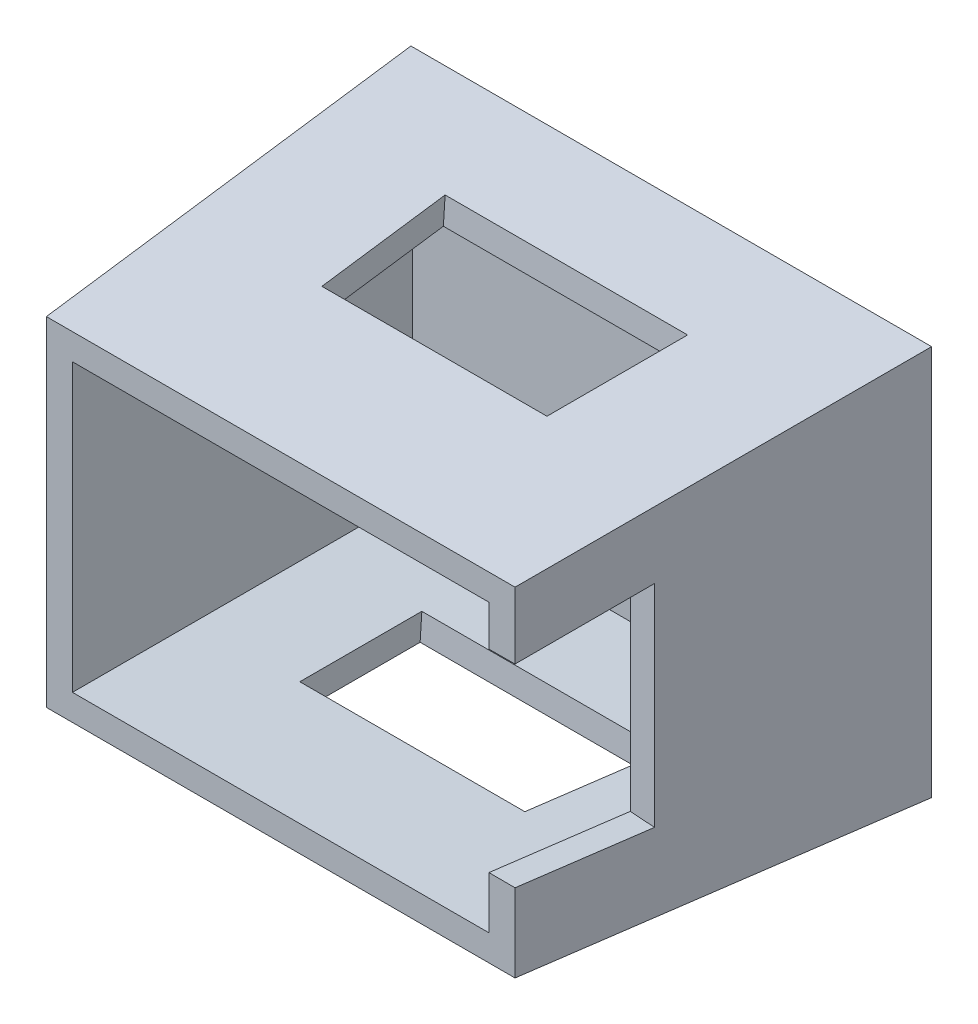
ISO-10303-21;
HEADER;
FILE_DESCRIPTION(('STEP AP214'),'2;1');
FILE_NAME('part.step','',(''),(''),'','','');
FILE_SCHEMA(('AUTOMOTIVE_DESIGN { 1 0 10303 214 1 1 1 1 }'));
ENDSEC;
DATA;
#1=APPLICATION_CONTEXT('core data for automotive mechanical design processes');
#2=APPLICATION_PROTOCOL_DEFINITION('international standard','automotive_design',2000,#1);
#3=PRODUCT_CONTEXT('',#1,'mechanical');
#4=PRODUCT('Part','Part','',(#3));
#5=PRODUCT_RELATED_PRODUCT_CATEGORY('part','',(#4));
#6=PRODUCT_DEFINITION_FORMATION('','',#4);
#7=PRODUCT_DEFINITION_CONTEXT('part definition',#1,'design');
#8=PRODUCT_DEFINITION('design','',#6,#7);
#9=PRODUCT_DEFINITION_SHAPE('','',#8);
#10=(LENGTH_UNIT() NAMED_UNIT(*) SI_UNIT(.MILLI.,.METRE.));
#11=(NAMED_UNIT(*) PLANE_ANGLE_UNIT() SI_UNIT($,.RADIAN.));
#12=(NAMED_UNIT(*) SI_UNIT($,.STERADIAN.) SOLID_ANGLE_UNIT());
#13=UNCERTAINTY_MEASURE_WITH_UNIT(LENGTH_MEASURE(1.E-05),#10,'distance_accuracy_value','');
#14=(GEOMETRIC_REPRESENTATION_CONTEXT(3) GLOBAL_UNCERTAINTY_ASSIGNED_CONTEXT((#13)) GLOBAL_UNIT_ASSIGNED_CONTEXT((#10,
#11,#12)) REPRESENTATION_CONTEXT('',''));
#15=CARTESIAN_POINT('',(0.,0.,0.));
#16=DIRECTION('',(0.,0.,1.));
#17=DIRECTION('',(1.,0.,0.));
#18=AXIS2_PLACEMENT_3D('',#15,#16,#17);
#19=CARTESIAN_POINT('',(0.,0.,0.));
#20=DIRECTION('',(0.,0.,1.));
#21=DIRECTION('',(1.,0.,0.));
#22=AXIS2_PLACEMENT_3D('',#19,#20,#21);
#23=PLANE('',#22);
#24=DIRECTION('',(0.,1.,0.));
#25=VECTOR('',#24,1.);
#26=CARTESIAN_POINT('',(20.,15.,0.));
#27=LINE('',#26,#25);
#28=CARTESIAN_POINT('',(20.,-15.,0.));
#29=VERTEX_POINT('',#28);
#30=CARTESIAN_POINT('',(20.,15.,0.));
#31=VERTEX_POINT('',#30);
#32=EDGE_CURVE('E450',#29,#31,#27,.T.);
#33=ORIENTED_EDGE('',*,*,#32,.F.);
#34=DIRECTION('',(1.,0.,0.));
#35=VECTOR('',#34,1.);
#36=CARTESIAN_POINT('',(-20.,-15.,0.));
#37=LINE('',#36,#35);
#38=CARTESIAN_POINT('',(-20.,-15.,0.));
#39=VERTEX_POINT('',#38);
#40=EDGE_CURVE('E439',#39,#29,#37,.T.);
#41=ORIENTED_EDGE('',*,*,#40,.F.);
#42=DIRECTION('',(0.,-1.,0.));
#43=VECTOR('',#42,1.);
#44=CARTESIAN_POINT('',(-20.,15.,0.));
#45=LINE('',#44,#43);
#46=CARTESIAN_POINT('',(-20.,15.,0.));
#47=VERTEX_POINT('',#46);
#48=EDGE_CURVE('E481',#47,#39,#45,.T.);
#49=ORIENTED_EDGE('',*,*,#48,.F.);
#50=DIRECTION('',(-1.,0.,0.));
#51=VECTOR('',#50,1.);
#52=CARTESIAN_POINT('',(-20.,15.,0.));
#53=LINE('',#52,#51);
#54=EDGE_CURVE('E463',#31,#47,#53,.T.);
#55=ORIENTED_EDGE('',*,*,#54,.F.);
#56=EDGE_LOOP('',(#33,#41,#49,#55));
#57=FACE_BOUND('',#56,.T.);
#58=ADVANCED_FACE('F49',(#57),#23,.F.);
#59=CARTESIAN_POINT('',(0.,0.,30.));
#60=DIRECTION('',(0.,0.,1.));
#61=DIRECTION('',(1.,0.,0.));
#62=AXIS2_PLACEMENT_3D('',#59,#60,#61);
#63=PLANE('',#62);
#64=DIRECTION('',(-0.999990210810202,-0.00442473544606308,0.));
#65=VECTOR('',#64,1.);
#66=CARTESIAN_POINT('',(-0.0345436760984829,7.80687079825672,30.));
#67=LINE('',#66,#65);
#68=CARTESIAN_POINT('',(18.,7.88666966408016,30.));
#69=VERTEX_POINT('',#68);
#70=CARTESIAN_POINT('',(15.9955604828836,7.877800462677,30.));
#71=VERTEX_POINT('',#70);
#72=EDGE_CURVE('E219',#69,#71,#67,.T.);
#73=ORIENTED_EDGE('',*,*,#72,.F.);
#74=DIRECTION('',(0.,1.,0.));
#75=VECTOR('',#74,1.);
#76=CARTESIAN_POINT('',(18.,-13.,30.));
#77=LINE('',#76,#75);
#78=CARTESIAN_POINT('',(18.,13.,30.));
#79=VERTEX_POINT('',#78);
#80=EDGE_CURVE('E53',#69,#79,#77,.T.);
#81=ORIENTED_EDGE('',*,*,#80,.T.);
#82=DIRECTION('',(-1.,0.,0.));
#83=VECTOR('',#82,1.);
#84=CARTESIAN_POINT('',(18.,13.,30.));
#85=LINE('',#84,#83);
#86=CARTESIAN_POINT('',(-18.,13.,30.));
#87=VERTEX_POINT('',#86);
#88=EDGE_CURVE('E345',#79,#87,#85,.T.);
#89=ORIENTED_EDGE('',*,*,#88,.T.);
#90=DIRECTION('',(0.,-1.,0.));
#91=VECTOR('',#90,1.);
#92=CARTESIAN_POINT('',(-18.,13.,30.));
#93=LINE('',#92,#91);
#94=CARTESIAN_POINT('',(-18.,-13.,30.));
#95=VERTEX_POINT('',#94);
#96=EDGE_CURVE('E303',#87,#95,#93,.T.);
#97=ORIENTED_EDGE('',*,*,#96,.T.);
#98=DIRECTION('',(1.,0.,0.));
#99=VECTOR('',#98,1.);
#100=CARTESIAN_POINT('',(-18.,-13.,30.));
#101=LINE('',#100,#99);
#102=CARTESIAN_POINT('',(18.,-13.,30.));
#103=VERTEX_POINT('',#102);
#104=EDGE_CURVE('E278',#95,#103,#101,.T.);
#105=ORIENTED_EDGE('',*,*,#104,.T.);
#106=CARTESIAN_POINT('',(18.,-6.99812651430582,30.));
#107=VERTEX_POINT('',#106);
#108=EDGE_CURVE('E390',#103,#107,#77,.T.);
#109=ORIENTED_EDGE('',*,*,#108,.T.);
#110=DIRECTION('',(0.999990210810202,-0.0044247354460626,0.));
#111=VECTOR('',#110,1.);
#112=CARTESIAN_POINT('',(-0.0306121462151855,-6.9183450446323,30.));
#113=LINE('',#112,#111);
#114=CARTESIAN_POINT('',(15.9955604828836,-6.98925731290265,30.));
#115=VERTEX_POINT('',#114);
#116=EDGE_CURVE('E202',#115,#107,#113,.T.);
#117=ORIENTED_EDGE('',*,*,#116,.F.);
#118=DIRECTION('',(0.,1.,0.));
#119=VECTOR('',#118,1.);
#120=CARTESIAN_POINT('',(15.9955604828836,0.,30.));
#121=LINE('',#120,#119);
#122=CARTESIAN_POINT('',(15.9955604828836,-10.9955604828836,30.));
#123=VERTEX_POINT('',#122);
#124=EDGE_CURVE('E292',#123,#115,#121,.T.);
#125=ORIENTED_EDGE('',*,*,#124,.F.);
#126=DIRECTION('',(1.,0.,0.));
#127=VECTOR('',#126,1.);
#128=CARTESIAN_POINT('',(0.,-10.9955604828836,30.));
#129=LINE('',#128,#127);
#130=CARTESIAN_POINT('',(-15.9955604828836,-10.9955604828836,30.));
#131=VERTEX_POINT('',#130);
#132=EDGE_CURVE('E266',#131,#123,#129,.T.);
#133=ORIENTED_EDGE('',*,*,#132,.F.);
#134=DIRECTION('',(0.,-1.,0.));
#135=VECTOR('',#134,1.);
#136=CARTESIAN_POINT('',(-15.9955604828836,0.,30.));
#137=LINE('',#136,#135);
#138=CARTESIAN_POINT('',(-15.9955604828836,10.9955604828836,30.));
#139=VERTEX_POINT('',#138);
#140=EDGE_CURVE('E283',#139,#131,#137,.T.);
#141=ORIENTED_EDGE('',*,*,#140,.F.);
#142=DIRECTION('',(-1.,0.,0.));
#143=VECTOR('',#142,1.);
#144=CARTESIAN_POINT('',(0.,10.9955604828836,30.));
#145=LINE('',#144,#143);
#146=CARTESIAN_POINT('',(15.9955604828836,10.9955604828836,30.));
#147=VERTEX_POINT('',#146);
#148=EDGE_CURVE('E290',#147,#139,#145,.T.);
#149=ORIENTED_EDGE('',*,*,#148,.F.);
#150=EDGE_CURVE('E296',#71,#147,#121,.T.);
#151=ORIENTED_EDGE('',*,*,#150,.F.);
#152=EDGE_LOOP('',(#73,#81,#89,#97,#105,#109,#117,#125,#133,#141,#149,#151));
#153=FACE_BOUND('',#152,.T.);
#154=ADVANCED_FACE('F354',(#153),#63,.T.);
#155=CARTESIAN_POINT('',(0.,14.9336283185841,0.995575221238938));
#156=DIRECTION('',(0.,0.997785157856609,0.0665190105237739));
#157=DIRECTION('',(0.,-0.0665190105237739,0.997785157856609));
#158=AXIS2_PLACEMENT_3D('',#155,#156,#157);
#159=PLANE('',#158);
#160=DIRECTION('',(0.0657875188143328,0.0663749073751751,-0.995623610627626));
#161=VECTOR('',#160,1.);
#162=CARTESIAN_POINT('',(9.73704773880092,14.8909253133861,1.63612029920846));
#163=LINE('',#162,#161);
#164=CARTESIAN_POINT('',(8.64309063077101,13.7872007311774,18.1919890323396));
#165=VERTEX_POINT('',#164);
#166=CARTESIAN_POINT('',(9.31271042029553,14.4627992688226,8.05801096766043));
#167=VERTEX_POINT('',#166);
#168=EDGE_CURVE('E264',#165,#167,#163,.T.);
#169=ORIENTED_EDGE('',*,*,#168,.F.);
#170=DIRECTION('',(1.,0.,0.));
#171=VECTOR('',#170,1.);
#172=CARTESIAN_POINT('',(0.,13.7872007311774,18.1919890323396));
#173=LINE('',#172,#171);
#174=CARTESIAN_POINT('',(-8.64309063077102,13.7872007311774,18.1919890323396));
#175=VERTEX_POINT('',#174);
#176=EDGE_CURVE('E249',#175,#165,#173,.T.);
#177=ORIENTED_EDGE('',*,*,#176,.F.);
#178=DIRECTION('',(0.0657875188143328,-0.0663749073751751,0.995623610627626));
#179=VECTOR('',#178,1.);
#180=CARTESIAN_POINT('',(-9.73704773880093,14.8909253133861,1.63612029920846));
#181=LINE('',#180,#179);
#182=CARTESIAN_POINT('',(-9.31271042029555,14.4627992688226,8.05801096766045));
#183=VERTEX_POINT('',#182);
#184=EDGE_CURVE('E254',#183,#175,#181,.T.);
#185=ORIENTED_EDGE('',*,*,#184,.F.);
#186=DIRECTION('',(-1.,0.,0.));
#187=VECTOR('',#186,1.);
#188=CARTESIAN_POINT('',(0.,14.4627992688226,8.05801096766043));
#189=LINE('',#188,#187);
#190=EDGE_CURVE('E259',#167,#183,#189,.T.);
#191=ORIENTED_EDGE('',*,*,#190,.F.);
#192=EDGE_LOOP('',(#169,#177,#185,#191));
#193=FACE_BOUND('',#192,.T.);
#194=DIRECTION('',(0.0663723311599973,0.0663723311599972,-0.995584967399958));
#195=VECTOR('',#194,1.);
#196=CARTESIAN_POINT('',(18.,13.,30.));
#197=LINE('',#196,#195);
#198=EDGE_CURVE('E344',#79,#31,#197,.T.);
#199=ORIENTED_EDGE('',*,*,#198,.T.);
#200=ORIENTED_EDGE('',*,*,#54,.T.);
#201=DIRECTION('',(-0.0663723311599973,0.0663723311599972,-0.995584967399958));
#202=VECTOR('',#201,1.);
#203=CARTESIAN_POINT('',(-18.,13.,30.));
#204=LINE('',#203,#202);
#205=EDGE_CURVE('E309',#87,#47,#204,.T.);
#206=ORIENTED_EDGE('',*,*,#205,.F.);
#207=ORIENTED_EDGE('',*,*,#88,.F.);
#208=EDGE_LOOP('',(#199,#200,#206,#207));
#209=FACE_BOUND('',#208,.T.);
#210=ADVANCED_FACE('F321',(#193,#209),#159,.T.);
#211=CARTESIAN_POINT('',(-19.9115044247788,0.,1.32743362831859));
#212=DIRECTION('',(-0.997785157856609,0.,0.066519010523774));
#213=DIRECTION('',(0.066519010523774,0.,0.997785157856609));
#214=AXIS2_PLACEMENT_3D('',#211,#212,#213);
#215=PLANE('',#214);
#216=ORIENTED_EDGE('',*,*,#205,.T.);
#217=ORIENTED_EDGE('',*,*,#48,.T.);
#218=DIRECTION('',(-0.0663723311599973,-0.0663723311599972,-0.995584967399958));
#219=VECTOR('',#218,1.);
#220=CARTESIAN_POINT('',(-18.,-13.,30.));
#221=LINE('',#220,#219);
#222=EDGE_CURVE('E405',#95,#39,#221,.T.);
#223=ORIENTED_EDGE('',*,*,#222,.F.);
#224=ORIENTED_EDGE('',*,*,#96,.F.);
#225=EDGE_LOOP('',(#216,#217,#223,#224));
#226=FACE_BOUND('',#225,.T.);
#227=ADVANCED_FACE('F311',(#226),#215,.T.);
#228=CARTESIAN_POINT('',(19.9115044247788,0.,1.32743362831858));
#229=DIRECTION('',(0.997785157856609,0.,0.066519010523774));
#230=DIRECTION('',(0.066519010523774,0.,-0.997785157856609));
#231=AXIS2_PLACEMENT_3D('',#228,#229,#230);
#232=PLANE('',#231);
#233=DIRECTION('',(-0.0663723311599971,-0.0663723311599972,0.995584967399958));
#234=VECTOR('',#233,1.);
#235=CARTESIAN_POINT('',(18.6696197895245,8.55628945360469,19.9557031571322));
#236=LINE('',#235,#234);
#237=CARTESIAN_POINT('',(18.6696197895245,8.55628945360469,19.9557031571322));
#238=VERTEX_POINT('',#237);
#239=EDGE_CURVE('E196',#238,#69,#236,.T.);
#240=ORIENTED_EDGE('',*,*,#239,.F.);
#241=DIRECTION('',(0.,1.,0.));
#242=VECTOR('',#241,1.);
#243=CARTESIAN_POINT('',(18.6696197895245,-7.66774630383034,19.9557031571322));
#244=LINE('',#243,#242);
#245=CARTESIAN_POINT('',(18.6696197895245,-7.66774630383034,19.9557031571322));
#246=VERTEX_POINT('',#245);
#247=EDGE_CURVE('E191',#246,#238,#244,.T.);
#248=ORIENTED_EDGE('',*,*,#247,.F.);
#249=DIRECTION('',(0.0663723311599971,-0.066372331159997,-0.995584967399958));
#250=VECTOR('',#249,1.);
#251=CARTESIAN_POINT('',(17.8333923553205,-6.83151886962631,32.4991146701926));
#252=LINE('',#251,#250);
#253=EDGE_CURVE('E199',#107,#246,#252,.T.);
#254=ORIENTED_EDGE('',*,*,#253,.F.);
#255=ORIENTED_EDGE('',*,*,#108,.F.);
#256=DIRECTION('',(0.0663723311599973,-0.0663723311599972,-0.995584967399958));
#257=VECTOR('',#256,1.);
#258=CARTESIAN_POINT('',(18.,-13.,30.));
#259=LINE('',#258,#257);
#260=EDGE_CURVE('E396',#103,#29,#259,.T.);
#261=ORIENTED_EDGE('',*,*,#260,.T.);
#262=ORIENTED_EDGE('',*,*,#32,.T.);
#263=ORIENTED_EDGE('',*,*,#198,.F.);
#264=ORIENTED_EDGE('',*,*,#80,.F.);
#265=EDGE_LOOP('',(#240,#248,#254,#255,#261,#262,#263,#264));
#266=FACE_BOUND('',#265,.T.);
#267=ADVANCED_FACE('F206',(#266),#232,.T.);
#268=CARTESIAN_POINT('',(0.,-14.9336283185841,0.995575221238938));
#269=DIRECTION('',(0.,-0.997785157856609,0.0665190105237739));
#270=DIRECTION('',(0.,-0.0665190105237739,-0.997785157856609));
#271=AXIS2_PLACEMENT_3D('',#268,#269,#270);
#272=PLANE('',#271);
#273=DIRECTION('',(-0.0663723311599972,0.0663723311599972,0.995584967399958));
#274=VECTOR('',#273,1.);
#275=CARTESIAN_POINT('',(9.86786572145604,-14.8899651959228,1.65052206115859));
#276=LINE('',#275,#274);
#277=CARTESIAN_POINT('',(9.31271042029553,-14.3348098947623,9.97785157856609));
#278=VERTEX_POINT('',#277);
#279=CARTESIAN_POINT('',(8.64309063077101,-13.6651901052377,20.0221484214339));
#280=VERTEX_POINT('',#279);
#281=EDGE_CURVE('E221',#278,#280,#276,.T.);
#282=ORIENTED_EDGE('',*,*,#281,.F.);
#283=DIRECTION('',(1.,0.,0.));
#284=VECTOR('',#283,1.);
#285=CARTESIAN_POINT('',(0.,-14.3348098947623,9.97785157856609));
#286=LINE('',#285,#284);
#287=CARTESIAN_POINT('',(-9.31271042029555,-14.3348098947623,9.9778515785661));
#288=VERTEX_POINT('',#287);
#289=EDGE_CURVE('E231',#288,#278,#286,.T.);
#290=ORIENTED_EDGE('',*,*,#289,.F.);
#291=DIRECTION('',(-0.0663723311599972,-0.0663723311599972,-0.995584967399958));
#292=VECTOR('',#291,1.);
#293=CARTESIAN_POINT('',(-9.86786572145605,-14.8899651959228,1.65052206115859));
#294=LINE('',#293,#292);
#295=CARTESIAN_POINT('',(-8.64309063077102,-13.6651901052377,20.0221484214339));
#296=VERTEX_POINT('',#295);
#297=EDGE_CURVE('E228',#296,#288,#294,.T.);
#298=ORIENTED_EDGE('',*,*,#297,.F.);
#299=DIRECTION('',(-1.,0.,0.));
#300=VECTOR('',#299,1.);
#301=CARTESIAN_POINT('',(0.,-13.6651901052377,20.0221484214339));
#302=LINE('',#301,#300);
#303=EDGE_CURVE('E225',#280,#296,#302,.T.);
#304=ORIENTED_EDGE('',*,*,#303,.F.);
#305=EDGE_LOOP('',(#282,#290,#298,#304));
#306=FACE_BOUND('',#305,.T.);
#307=ORIENTED_EDGE('',*,*,#222,.T.);
#308=ORIENTED_EDGE('',*,*,#40,.T.);
#309=ORIENTED_EDGE('',*,*,#260,.F.);
#310=ORIENTED_EDGE('',*,*,#104,.F.);
#311=EDGE_LOOP('',(#307,#308,#309,#310));
#312=FACE_BOUND('',#311,.T.);
#313=ADVANCED_FACE('F418',(#306,#312),#272,.T.);
#314=CARTESIAN_POINT('',(0.,0.,2.));
#315=DIRECTION('',(0.,0.,1.));
#316=DIRECTION('',(1.,0.,0.));
#317=AXIS2_PLACEMENT_3D('',#314,#315,#316);
#318=PLANE('',#317);
#319=DIRECTION('',(0.,1.,0.));
#320=VECTOR('',#319,1.);
#321=CARTESIAN_POINT('',(17.8622271495503,0.,2.));
#322=LINE('',#321,#320);
#323=CARTESIAN_POINT('',(17.8622271495503,-12.8622271495503,2.));
#324=VERTEX_POINT('',#323);
#325=CARTESIAN_POINT('',(17.8622271495503,12.8622271495503,2.));
#326=VERTEX_POINT('',#325);
#327=EDGE_CURVE('E267',#324,#326,#322,.T.);
#328=ORIENTED_EDGE('',*,*,#327,.T.);
#329=DIRECTION('',(-1.,0.,0.));
#330=VECTOR('',#329,1.);
#331=CARTESIAN_POINT('',(0.,12.8622271495503,2.));
#332=LINE('',#331,#330);
#333=CARTESIAN_POINT('',(-17.8622271495503,12.8622271495503,2.));
#334=VERTEX_POINT('',#333);
#335=EDGE_CURVE('E275',#326,#334,#332,.T.);
#336=ORIENTED_EDGE('',*,*,#335,.T.);
#337=DIRECTION('',(0.,-1.,0.));
#338=VECTOR('',#337,1.);
#339=CARTESIAN_POINT('',(-17.8622271495503,0.,2.));
#340=LINE('',#339,#338);
#341=CARTESIAN_POINT('',(-17.8622271495503,-12.8622271495503,2.));
#342=VERTEX_POINT('',#341);
#343=EDGE_CURVE('E273',#334,#342,#340,.T.);
#344=ORIENTED_EDGE('',*,*,#343,.T.);
#345=DIRECTION('',(1.,0.,0.));
#346=VECTOR('',#345,1.);
#347=CARTESIAN_POINT('',(0.,-12.8622271495503,2.));
#348=LINE('',#347,#346);
#349=EDGE_CURVE('E270',#342,#324,#348,.T.);
#350=ORIENTED_EDGE('',*,*,#349,.T.);
#351=EDGE_LOOP('',(#328,#336,#344,#350));
#352=FACE_BOUND('',#351,.T.);
#353=ADVANCED_FACE('F426',(#352),#318,.T.);
#354=CARTESIAN_POINT('',(0.,12.9380580028709,0.86253720019139));
#355=DIRECTION('',(0.,0.997785157856609,0.0665190105237739));
#356=DIRECTION('',(0.,-0.0665190105237739,0.997785157856609));
#357=AXIS2_PLACEMENT_3D('',#354,#355,#356);
#358=PLANE('',#357);
#359=DIRECTION('',(1.,0.,0.));
#360=VECTOR('',#359,1.);
#361=CARTESIAN_POINT('',(0.,11.7738128233596,18.3262148928608));
#362=LINE('',#361,#360);
#363=CARTESIAN_POINT('',(-8.64309063077102,11.7738128233596,18.3262148928608));
#364=VERTEX_POINT('',#363);
#365=CARTESIAN_POINT('',(8.64309063077101,11.7738128233596,18.3262148928608));
#366=VERTEX_POINT('',#365);
#367=EDGE_CURVE('E246',#364,#366,#362,.T.);
#368=ORIENTED_EDGE('',*,*,#367,.T.);
#369=DIRECTION('',(0.0657875188143328,0.0663749073751751,-0.995623610627626));
#370=VECTOR('',#369,1.);
#371=CARTESIAN_POINT('',(9.754631221032,12.8952778831765,1.50423899560739));
#372=LINE('',#371,#370);
#373=CARTESIAN_POINT('',(9.31271042029553,12.4494113610048,8.19223682818162));
#374=VERTEX_POINT('',#373);
#375=EDGE_CURVE('E261',#366,#374,#372,.T.);
#376=ORIENTED_EDGE('',*,*,#375,.T.);
#377=DIRECTION('',(-1.,0.,0.));
#378=VECTOR('',#377,1.);
#379=CARTESIAN_POINT('',(0.,12.4494113610048,8.19223682818162));
#380=LINE('',#379,#378);
#381=CARTESIAN_POINT('',(-9.31271042029555,12.4494113610048,8.19223682818163));
#382=VERTEX_POINT('',#381);
#383=EDGE_CURVE('E256',#374,#382,#380,.T.);
#384=ORIENTED_EDGE('',*,*,#383,.T.);
#385=DIRECTION('',(0.0657875188143328,-0.0663749073751751,0.995623610627626));
#386=VECTOR('',#385,1.);
#387=CARTESIAN_POINT('',(-9.75463122103201,12.8952778831765,1.50423899560739));
#388=LINE('',#387,#386);
#389=EDGE_CURVE('E251',#382,#364,#388,.T.);
#390=ORIENTED_EDGE('',*,*,#389,.T.);
#391=EDGE_LOOP('',(#368,#376,#384,#390));
#392=FACE_BOUND('',#391,.T.);
#393=DIRECTION('',(0.0663723311599972,0.0663723311599972,-0.995584967399958));
#394=VECTOR('',#393,1.);
#395=CARTESIAN_POINT('',(17.8590357209199,12.8590357209199,2.04787142945598));
#396=LINE('',#395,#394);
#397=EDGE_CURVE('E279',#147,#326,#396,.T.);
#398=ORIENTED_EDGE('',*,*,#397,.F.);
#399=ORIENTED_EDGE('',*,*,#148,.T.);
#400=DIRECTION('',(-0.0663723311599973,0.0663723311599972,-0.995584967399958));
#401=VECTOR('',#400,1.);
#402=CARTESIAN_POINT('',(-17.8590357209199,12.8590357209199,2.04787142945599));
#403=LINE('',#402,#401);
#404=EDGE_CURVE('E282',#139,#334,#403,.T.);
#405=ORIENTED_EDGE('',*,*,#404,.T.);
#406=ORIENTED_EDGE('',*,*,#335,.F.);
#407=EDGE_LOOP('',(#398,#399,#405,#406));
#408=FACE_BOUND('',#407,.T.);
#409=ADVANCED_FACE('F529',(#392,#408),#358,.F.);
#410=CARTESIAN_POINT('',(-17.9159341090655,0.,1.19439560727104));
#411=DIRECTION('',(-0.997785157856609,0.,0.066519010523774));
#412=DIRECTION('',(0.066519010523774,0.,0.997785157856609));
#413=AXIS2_PLACEMENT_3D('',#410,#411,#412);
#414=PLANE('',#413);
#415=ORIENTED_EDGE('',*,*,#404,.F.);
#416=ORIENTED_EDGE('',*,*,#140,.T.);
#417=DIRECTION('',(-0.0663723311599973,-0.0663723311599972,-0.995584967399958));
#418=VECTOR('',#417,1.);
#419=CARTESIAN_POINT('',(-17.8590357209199,-12.8590357209199,2.04787142945599));
#420=LINE('',#419,#418);
#421=EDGE_CURVE('E271',#131,#342,#420,.T.);
#422=ORIENTED_EDGE('',*,*,#421,.T.);
#423=ORIENTED_EDGE('',*,*,#343,.F.);
#424=EDGE_LOOP('',(#415,#416,#422,#423));
#425=FACE_BOUND('',#424,.T.);
#426=ADVANCED_FACE('F537',(#425),#414,.F.);
#427=CARTESIAN_POINT('',(17.9159341090655,0.,1.19439560727104));
#428=DIRECTION('',(0.997785157856609,0.,0.066519010523774));
#429=DIRECTION('',(0.066519010523774,0.,-0.997785157856609));
#430=AXIS2_PLACEMENT_3D('',#427,#428,#429);
#431=PLANE('',#430);
#432=DIRECTION('',(0.,1.,0.));
#433=VECTOR('',#432,1.);
#434=CARTESIAN_POINT('',(16.6740494738113,0.,19.8226651360846));
#435=LINE('',#434,#433);
#436=CARTESIAN_POINT('',(16.6740494738113,-7.66774630383034,19.8226651360846));
#437=VERTEX_POINT('',#436);
#438=CARTESIAN_POINT('',(16.6740494738113,8.55628945360469,19.8226651360846));
#439=VERTEX_POINT('',#438);
#440=EDGE_CURVE('E59',#437,#439,#435,.T.);
#441=ORIENTED_EDGE('',*,*,#440,.T.);
#442=DIRECTION('',(-0.0663723311599972,-0.0663723311599972,0.995584967399958));
#443=VECTOR('',#442,1.);
#444=CARTESIAN_POINT('',(17.8727703465595,9.75501032635294,1.84185204486083));
#445=LINE('',#444,#443);
#446=EDGE_CURVE('E12',#439,#71,#445,.T.);
#447=ORIENTED_EDGE('',*,*,#446,.T.);
#448=ORIENTED_EDGE('',*,*,#150,.T.);
#449=ORIENTED_EDGE('',*,*,#397,.T.);
#450=ORIENTED_EDGE('',*,*,#327,.F.);
#451=DIRECTION('',(0.0663723311599973,-0.0663723311599972,-0.995584967399958));
#452=VECTOR('',#451,1.);
#453=CARTESIAN_POINT('',(17.8590357209199,-12.8590357209199,2.04787142945598));
#454=LINE('',#453,#452);
#455=EDGE_CURVE('E285',#123,#324,#454,.T.);
#456=ORIENTED_EDGE('',*,*,#455,.F.);
#457=ORIENTED_EDGE('',*,*,#124,.T.);
#458=DIRECTION('',(0.0663723311599973,-0.066372331159997,-0.995584967399958));
#459=VECTOR('',#458,1.);
#460=CARTESIAN_POINT('',(17.876684633563,-8.870381463582,1.78313773980966));
#461=LINE('',#460,#459);
#462=EDGE_CURVE('E516',#115,#437,#461,.T.);
#463=ORIENTED_EDGE('',*,*,#462,.T.);
#464=EDGE_LOOP('',(#441,#447,#448,#449,#450,#456,#457,#463));
#465=FACE_BOUND('',#464,.T.);
#466=ADVANCED_FACE('F518',(#465),#431,.F.);
#467=CARTESIAN_POINT('',(0.,-12.9380580028708,0.86253720019139));
#468=DIRECTION('',(0.,-0.997785157856609,0.0665190105237739));
#469=DIRECTION('',(0.,-0.0665190105237739,-0.997785157856609));
#470=AXIS2_PLACEMENT_3D('',#467,#468,#469);
#471=PLANE('',#470);
#472=DIRECTION('',(1.,0.,0.));
#473=VECTOR('',#472,1.);
#474=CARTESIAN_POINT('',(0.,-12.339239579049,9.84481355751854));
#475=LINE('',#474,#473);
#476=CARTESIAN_POINT('',(-9.31271042029555,-12.339239579049,9.84481355751856));
#477=VERTEX_POINT('',#476);
#478=CARTESIAN_POINT('',(9.31271042029553,-12.339239579049,9.84481355751855));
#479=VERTEX_POINT('',#478);
#480=EDGE_CURVE('E510',#477,#479,#475,.T.);
#481=ORIENTED_EDGE('',*,*,#480,.T.);
#482=DIRECTION('',(-0.0663723311599972,0.0663723311599972,0.995584967399958));
#483=VECTOR('',#482,1.);
#484=CARTESIAN_POINT('',(9.86786572145604,-12.8943948802095,1.51748404011104));
#485=LINE('',#484,#483);
#486=CARTESIAN_POINT('',(8.64309063077101,-11.6696197895245,19.8891104003864));
#487=VERTEX_POINT('',#486);
#488=EDGE_CURVE('E513',#479,#487,#485,.T.);
#489=ORIENTED_EDGE('',*,*,#488,.T.);
#490=DIRECTION('',(-1.,0.,0.));
#491=VECTOR('',#490,1.);
#492=CARTESIAN_POINT('',(0.,-11.6696197895245,19.8891104003864));
#493=LINE('',#492,#491);
#494=CARTESIAN_POINT('',(-8.64309063077102,-11.6696197895245,19.8891104003864));
#495=VERTEX_POINT('',#494);
#496=EDGE_CURVE('E499',#487,#495,#493,.T.);
#497=ORIENTED_EDGE('',*,*,#496,.T.);
#498=DIRECTION('',(-0.0663723311599972,-0.0663723311599972,-0.995584967399958));
#499=VECTOR('',#498,1.);
#500=CARTESIAN_POINT('',(-9.86786572145605,-12.8943948802095,1.51748404011104));
#501=LINE('',#500,#499);
#502=EDGE_CURVE('E507',#495,#477,#501,.T.);
#503=ORIENTED_EDGE('',*,*,#502,.T.);
#504=EDGE_LOOP('',(#481,#489,#497,#503));
#505=FACE_BOUND('',#504,.T.);
#506=ORIENTED_EDGE('',*,*,#421,.F.);
#507=ORIENTED_EDGE('',*,*,#132,.T.);
#508=ORIENTED_EDGE('',*,*,#455,.T.);
#509=ORIENTED_EDGE('',*,*,#349,.F.);
#510=EDGE_LOOP('',(#506,#507,#508,#509));
#511=FACE_BOUND('',#510,.T.);
#512=ADVANCED_FACE('F363',(#505,#511),#471,.F.);
#513=CARTESIAN_POINT('',(0.,16.2021727266207,18.03099089931));
#514=DIRECTION('',(0.,0.066519010523774,0.997785157856609));
#515=DIRECTION('',(0.,-0.997785157856609,0.066519010523774));
#516=AXIS2_PLACEMENT_3D('',#513,#514,#515);
#517=PLANE('',#516);
#518=DIRECTION('',(0.,-0.997785157856609,0.066519010523774));
#519=VECTOR('',#518,1.);
#520=CARTESIAN_POINT('',(8.64309063077101,16.2021727266207,18.0309908993101));
#521=LINE('',#520,#519);
#522=EDGE_CURVE('E234',#487,#280,#521,.T.);
#523=ORIENTED_EDGE('',*,*,#522,.T.);
#524=ORIENTED_EDGE('',*,*,#303,.T.);
#525=DIRECTION('',(0.,-0.997785157856609,0.066519010523774));
#526=VECTOR('',#525,1.);
#527=CARTESIAN_POINT('',(-8.64309063077102,16.2021727266207,18.03099089931));
#528=LINE('',#527,#526);
#529=EDGE_CURVE('E241',#495,#296,#528,.T.);
#530=ORIENTED_EDGE('',*,*,#529,.F.);
#531=ORIENTED_EDGE('',*,*,#496,.F.);
#532=EDGE_LOOP('',(#523,#524,#530,#531));
#533=FACE_BOUND('',#532,.T.);
#534=ADVANCED_FACE('F597',(#533),#517,.F.);
#535=CARTESIAN_POINT('',(-9.86786572145605,14.9773976359356,-0.340635460965308));
#536=DIRECTION('',(-0.997794925651753,0.00441502179491926,0.0662253269237889));
#537=DIRECTION('',(0.0662259723790841,0.,0.997804650511534));
#538=AXIS2_PLACEMENT_3D('',#535,#536,#537);
#539=PLANE('',#538);
#540=ORIENTED_EDGE('',*,*,#529,.T.);
#541=ORIENTED_EDGE('',*,*,#297,.T.);
#542=DIRECTION('',(0.,-0.997785157856609,0.066519010523774));
#543=VECTOR('',#542,1.);
#544=CARTESIAN_POINT('',(-9.31271042029555,15.5325529370962,7.98669405644221));
#545=LINE('',#544,#543);
#546=EDGE_CURVE('E239',#477,#288,#545,.T.);
#547=ORIENTED_EDGE('',*,*,#546,.F.);
#548=ORIENTED_EDGE('',*,*,#502,.F.);
#549=EDGE_LOOP('',(#540,#541,#547,#548));
#550=FACE_BOUND('',#549,.T.);
#551=ADVANCED_FACE('F606',(#550),#539,.F.);
#552=CARTESIAN_POINT('',(0.,15.5325529370962,7.9866940564422));
#553=DIRECTION('',(0.,-0.066519010523774,-0.997785157856609));
#554=DIRECTION('',(0.,0.997785157856609,-0.066519010523774));
#555=AXIS2_PLACEMENT_3D('',#552,#553,#554);
#556=PLANE('',#555);
#557=ORIENTED_EDGE('',*,*,#546,.T.);
#558=ORIENTED_EDGE('',*,*,#289,.T.);
#559=DIRECTION('',(0.,-0.997785157856609,0.066519010523774));
#560=VECTOR('',#559,1.);
#561=CARTESIAN_POINT('',(9.31271042029553,15.5325529370962,7.9866940564422));
#562=LINE('',#561,#560);
#563=EDGE_CURVE('E235',#479,#278,#562,.T.);
#564=ORIENTED_EDGE('',*,*,#563,.F.);
#565=ORIENTED_EDGE('',*,*,#480,.F.);
#566=EDGE_LOOP('',(#557,#558,#564,#565));
#567=FACE_BOUND('',#566,.T.);
#568=ADVANCED_FACE('F617',(#567),#556,.F.);
#569=CARTESIAN_POINT('',(9.86786572145604,14.9773976359356,-0.340635460965308));
#570=DIRECTION('',(0.997794925651753,0.00441502179491926,0.0662253269237889));
#571=DIRECTION('',(0.0662259723790841,0.,-0.997804650511534));
#572=AXIS2_PLACEMENT_3D('',#569,#570,#571);
#573=PLANE('',#572);
#574=ORIENTED_EDGE('',*,*,#563,.T.);
#575=ORIENTED_EDGE('',*,*,#281,.T.);
#576=ORIENTED_EDGE('',*,*,#522,.F.);
#577=ORIENTED_EDGE('',*,*,#488,.F.);
#578=EDGE_LOOP('',(#574,#575,#576,#577));
#579=FACE_BOUND('',#578,.T.);
#580=ADVANCED_FACE('F628',(#579),#573,.F.);
#581=ORIENTED_EDGE('',*,*,#168,.T.);
#582=EDGE_CURVE('E237',#167,#374,#562,.T.);
#583=ORIENTED_EDGE('',*,*,#582,.T.);
#584=ORIENTED_EDGE('',*,*,#375,.F.);
#585=EDGE_CURVE('E243',#165,#366,#521,.T.);
#586=ORIENTED_EDGE('',*,*,#585,.F.);
#587=EDGE_LOOP('',(#581,#583,#584,#586));
#588=FACE_BOUND('',#587,.T.);
#589=ADVANCED_FACE('F639',(#588),#573,.F.);
#590=ORIENTED_EDGE('',*,*,#190,.T.);
#591=EDGE_CURVE('E238',#183,#382,#545,.T.);
#592=ORIENTED_EDGE('',*,*,#591,.T.);
#593=ORIENTED_EDGE('',*,*,#383,.F.);
#594=ORIENTED_EDGE('',*,*,#582,.F.);
#595=EDGE_LOOP('',(#590,#592,#593,#594));
#596=FACE_BOUND('',#595,.T.);
#597=ADVANCED_FACE('F631',(#596),#556,.F.);
#598=ORIENTED_EDGE('',*,*,#184,.T.);
#599=EDGE_CURVE('E75',#175,#364,#528,.T.);
#600=ORIENTED_EDGE('',*,*,#599,.T.);
#601=ORIENTED_EDGE('',*,*,#389,.F.);
#602=ORIENTED_EDGE('',*,*,#591,.F.);
#603=EDGE_LOOP('',(#598,#600,#601,#602));
#604=FACE_BOUND('',#603,.T.);
#605=ADVANCED_FACE('F620',(#604),#539,.F.);
#606=ORIENTED_EDGE('',*,*,#176,.T.);
#607=ORIENTED_EDGE('',*,*,#585,.T.);
#608=ORIENTED_EDGE('',*,*,#367,.F.);
#609=ORIENTED_EDGE('',*,*,#599,.F.);
#610=EDGE_LOOP('',(#606,#607,#608,#609));
#611=FACE_BOUND('',#610,.T.);
#612=ADVANCED_FACE('F609',(#611),#517,.F.);
#613=CARTESIAN_POINT('',(8.69176821095843,-7.66774630383034,19.2905130518944));
#614=DIRECTION('',(0.066519010523774,0.,-0.997785157856609));
#615=DIRECTION('',(-0.997785157856609,0.,-0.066519010523774));
#616=AXIS2_PLACEMENT_3D('',#613,#614,#615);
#617=PLANE('',#616);
#618=DIRECTION('',(0.997785157856609,0.,0.066519010523774));
#619=VECTOR('',#618,1.);
#620=CARTESIAN_POINT('',(8.69176821095843,-7.66774630383034,19.2905130518944));
#621=LINE('',#620,#619);
#622=EDGE_CURVE('E67',#437,#246,#621,.T.);
#623=ORIENTED_EDGE('',*,*,#622,.T.);
#624=ORIENTED_EDGE('',*,*,#247,.T.);
#625=DIRECTION('',(0.997785157856609,0.,0.066519010523774));
#626=VECTOR('',#625,1.);
#627=CARTESIAN_POINT('',(8.69176821095842,8.55628945360469,19.2905130518944));
#628=LINE('',#627,#626);
#629=EDGE_CURVE('E195',#439,#238,#628,.T.);
#630=ORIENTED_EDGE('',*,*,#629,.F.);
#631=ORIENTED_EDGE('',*,*,#440,.F.);
#632=EDGE_LOOP('',(#623,#624,#630,#631));
#633=FACE_BOUND('',#632,.T.);
#634=ADVANCED_FACE('F188',(#633),#617,.F.);
#635=CARTESIAN_POINT('',(8.69176821095842,8.55628945360469,19.2905130518944));
#636=DIRECTION('',(-0.0044150217949195,0.997794925651753,0.0662253269237889));
#637=DIRECTION('',(0.,-0.0662259723790841,0.997804650511534));
#638=AXIS2_PLACEMENT_3D('',#635,#636,#637);
#639=PLANE('',#638);
#640=ORIENTED_EDGE('',*,*,#72,.T.);
#641=ORIENTED_EDGE('',*,*,#446,.F.);
#642=ORIENTED_EDGE('',*,*,#629,.T.);
#643=ORIENTED_EDGE('',*,*,#239,.T.);
#644=EDGE_LOOP('',(#640,#641,#642,#643));
#645=FACE_BOUND('',#644,.T.);
#646=ADVANCED_FACE('F523',(#645),#639,.F.);
#647=CARTESIAN_POINT('',(7.8555407767544,-6.83151886962631,31.8339245649549));
#648=DIRECTION('',(-0.00441502179491902,-0.997794925651753,0.0662253269237887));
#649=DIRECTION('',(0.,-0.0662259723790839,-0.997804650511534));
#650=AXIS2_PLACEMENT_3D('',#647,#648,#649);
#651=PLANE('',#650);
#652=ORIENTED_EDGE('',*,*,#116,.T.);
#653=ORIENTED_EDGE('',*,*,#253,.T.);
#654=ORIENTED_EDGE('',*,*,#622,.F.);
#655=ORIENTED_EDGE('',*,*,#462,.F.);
#656=EDGE_LOOP('',(#652,#653,#654,#655));
#657=FACE_BOUND('',#656,.T.);
#658=ADVANCED_FACE('F200',(#657),#651,.F.);
#659=CLOSED_SHELL('',(#58,#154,#210,#227,#267,#313,#353,#409,#426,#466,#512,#534,#551,#568,#580,
#589,#597,#605,#612,#634,#646,#658));
#660=MANIFOLD_SOLID_BREP('B2',#659);
#661=ADVANCED_BREP_SHAPE_REPRESENTATION('',(#18,#660),#14);
#662=SHAPE_DEFINITION_REPRESENTATION(#9,#661);
ENDSEC;
END-ISO-10303-21;
